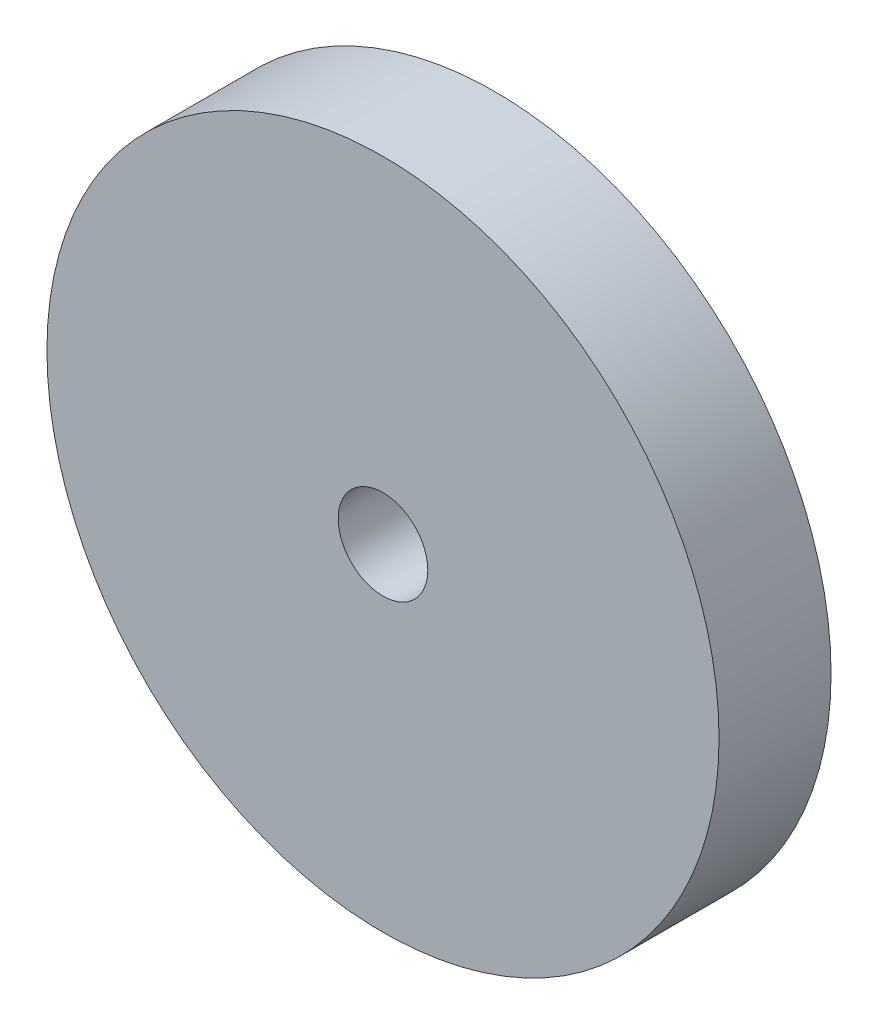
ISO-10303-21;
HEADER;
FILE_DESCRIPTION(('STEP AP214'),'2;1');
FILE_NAME('part.step','',(''),(''),'','','');
FILE_SCHEMA(('AUTOMOTIVE_DESIGN { 1 0 10303 214 1 1 1 1 }'));
ENDSEC;
DATA;
#1=APPLICATION_CONTEXT('core data for automotive mechanical design processes');
#2=APPLICATION_PROTOCOL_DEFINITION('international standard','automotive_design',2000,#1);
#3=PRODUCT_CONTEXT('',#1,'mechanical');
#4=PRODUCT('Part','Part','',(#3));
#5=PRODUCT_RELATED_PRODUCT_CATEGORY('part','',(#4));
#6=PRODUCT_DEFINITION_FORMATION('','',#4);
#7=PRODUCT_DEFINITION_CONTEXT('part definition',#1,'design');
#8=PRODUCT_DEFINITION('design','',#6,#7);
#9=PRODUCT_DEFINITION_SHAPE('','',#8);
#10=(LENGTH_UNIT() NAMED_UNIT(*) SI_UNIT(.MILLI.,.METRE.));
#11=(NAMED_UNIT(*) PLANE_ANGLE_UNIT() SI_UNIT($,.RADIAN.));
#12=(NAMED_UNIT(*) SI_UNIT($,.STERADIAN.) SOLID_ANGLE_UNIT());
#13=UNCERTAINTY_MEASURE_WITH_UNIT(LENGTH_MEASURE(1.E-05),#10,'distance_accuracy_value','');
#14=(GEOMETRIC_REPRESENTATION_CONTEXT(3) GLOBAL_UNCERTAINTY_ASSIGNED_CONTEXT((#13)) GLOBAL_UNIT_ASSIGNED_CONTEXT((#10,
#11,#12)) REPRESENTATION_CONTEXT('',''));
#15=CARTESIAN_POINT('',(0.,0.,0.));
#16=DIRECTION('',(0.,0.,1.));
#17=DIRECTION('',(1.,0.,0.));
#18=AXIS2_PLACEMENT_3D('',#15,#16,#17);
#19=CARTESIAN_POINT('',(0.,0.,5.));
#20=DIRECTION('',(0.,0.,-1.));
#21=DIRECTION('',(-1.,0.,0.));
#22=AXIS2_PLACEMENT_3D('',#19,#20,#21);
#23=CYLINDRICAL_SURFACE('',#22,15.);
#24=CARTESIAN_POINT('',(0.,0.,5.));
#25=DIRECTION('',(0.,0.,1.));
#26=DIRECTION('',(1.,0.,0.));
#27=AXIS2_PLACEMENT_3D('',#24,#25,#26);
#28=CIRCLE('',#27,15.);
#29=CARTESIAN_POINT('',(15.,0.,5.));
#30=VERTEX_POINT('',#29);
#31=EDGE_CURVE('E10',#30,#30,#28,.T.);
#32=ORIENTED_EDGE('',*,*,#31,.F.);
#33=EDGE_LOOP('',(#32));
#34=FACE_BOUND('',#33,.T.);
#35=CARTESIAN_POINT('',(0.,0.,0.));
#36=DIRECTION('',(0.,0.,1.));
#37=DIRECTION('',(1.,0.,0.));
#38=AXIS2_PLACEMENT_3D('',#35,#36,#37);
#39=CIRCLE('',#38,15.);
#40=CARTESIAN_POINT('',(15.,0.,0.));
#41=VERTEX_POINT('',#40);
#42=EDGE_CURVE('E34',#41,#41,#39,.T.);
#43=ORIENTED_EDGE('',*,*,#42,.T.);
#44=EDGE_LOOP('',(#43));
#45=FACE_BOUND('',#44,.T.);
#46=ADVANCED_FACE('F31',(#34,#45),#23,.T.);
#47=CARTESIAN_POINT('',(0.,0.,5.));
#48=DIRECTION('',(0.,0.,1.));
#49=DIRECTION('',(1.,0.,0.));
#50=AXIS2_PLACEMENT_3D('',#47,#48,#49);
#51=PLANE('',#50);
#52=CARTESIAN_POINT('',(0.,0.,5.));
#53=DIRECTION('',(0.,0.,1.));
#54=DIRECTION('',(1.,0.,0.));
#55=AXIS2_PLACEMENT_3D('',#52,#53,#54);
#56=CIRCLE('',#55,2.);
#57=CARTESIAN_POINT('',(2.,0.,5.));
#58=VERTEX_POINT('',#57);
#59=EDGE_CURVE('E45',#58,#58,#56,.T.);
#60=ORIENTED_EDGE('',*,*,#59,.F.);
#61=EDGE_LOOP('',(#60));
#62=FACE_BOUND('',#61,.T.);
#63=ORIENTED_EDGE('',*,*,#31,.T.);
#64=EDGE_LOOP('',(#63));
#65=FACE_BOUND('',#64,.T.);
#66=ADVANCED_FACE('F51',(#62,#65),#51,.T.);
#67=CARTESIAN_POINT('',(0.,0.,0.));
#68=DIRECTION('',(0.,0.,1.));
#69=DIRECTION('',(1.,0.,0.));
#70=AXIS2_PLACEMENT_3D('',#67,#68,#69);
#71=PLANE('',#70);
#72=CARTESIAN_POINT('',(0.,0.,0.));
#73=DIRECTION('',(0.,0.,1.));
#74=DIRECTION('',(1.,0.,0.));
#75=AXIS2_PLACEMENT_3D('',#72,#73,#74);
#76=CIRCLE('',#75,2.);
#77=CARTESIAN_POINT('',(2.,0.,0.));
#78=VERTEX_POINT('',#77);
#79=EDGE_CURVE('E41',#78,#78,#76,.F.);
#80=ORIENTED_EDGE('',*,*,#79,.F.);
#81=EDGE_LOOP('',(#80));
#82=FACE_BOUND('',#81,.T.);
#83=ORIENTED_EDGE('',*,*,#42,.F.);
#84=EDGE_LOOP('',(#83));
#85=FACE_BOUND('',#84,.T.);
#86=ADVANCED_FACE('F53',(#82,#85),#71,.F.);
#87=CARTESIAN_POINT('',(0.,0.,-5.65685424949238));
#88=DIRECTION('',(0.,0.,1.));
#89=DIRECTION('',(1.,0.,0.));
#90=AXIS2_PLACEMENT_3D('',#87,#88,#89);
#91=CYLINDRICAL_SURFACE('',#90,2.);
#92=ORIENTED_EDGE('',*,*,#79,.T.);
#93=EDGE_LOOP('',(#92));
#94=FACE_BOUND('',#93,.T.);
#95=ORIENTED_EDGE('',*,*,#59,.T.);
#96=EDGE_LOOP('',(#95));
#97=FACE_BOUND('',#96,.T.);
#98=ADVANCED_FACE('F49',(#94,#97),#91,.F.);
#99=CLOSED_SHELL('',(#46,#66,#86,#98));
#100=MANIFOLD_SOLID_BREP('B2',#99);
#101=ADVANCED_BREP_SHAPE_REPRESENTATION('',(#18,#100),#14);
#102=SHAPE_DEFINITION_REPRESENTATION(#9,#101);
ENDSEC;
END-ISO-10303-21;
